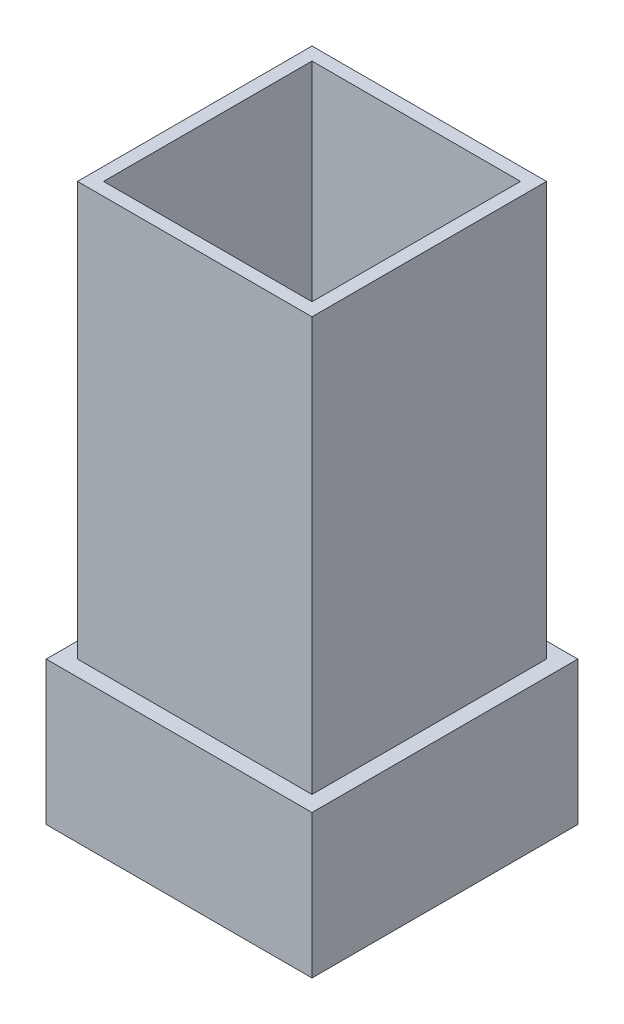
ISO-10303-21;
HEADER;
FILE_DESCRIPTION(('STEP AP214'),'2;1');
FILE_NAME('part.step','',(''),(''),'','','');
FILE_SCHEMA(('AUTOMOTIVE_DESIGN { 1 0 10303 214 1 1 1 1 }'));
ENDSEC;
DATA;
#1=APPLICATION_CONTEXT('core data for automotive mechanical design processes');
#2=APPLICATION_PROTOCOL_DEFINITION('international standard','automotive_design',2000,#1);
#3=PRODUCT_CONTEXT('',#1,'mechanical');
#4=PRODUCT('Part','Part','',(#3));
#5=PRODUCT_RELATED_PRODUCT_CATEGORY('part','',(#4));
#6=PRODUCT_DEFINITION_FORMATION('','',#4);
#7=PRODUCT_DEFINITION_CONTEXT('part definition',#1,'design');
#8=PRODUCT_DEFINITION('design','',#6,#7);
#9=PRODUCT_DEFINITION_SHAPE('','',#8);
#10=(LENGTH_UNIT() NAMED_UNIT(*) SI_UNIT(.MILLI.,.METRE.));
#11=(NAMED_UNIT(*) PLANE_ANGLE_UNIT() SI_UNIT($,.RADIAN.));
#12=(NAMED_UNIT(*) SI_UNIT($,.STERADIAN.) SOLID_ANGLE_UNIT());
#13=UNCERTAINTY_MEASURE_WITH_UNIT(LENGTH_MEASURE(1.E-05),#10,'distance_accuracy_value','');
#14=(GEOMETRIC_REPRESENTATION_CONTEXT(3) GLOBAL_UNCERTAINTY_ASSIGNED_CONTEXT((#13)) GLOBAL_UNIT_ASSIGNED_CONTEXT((#10,
#11,#12)) REPRESENTATION_CONTEXT('',''));
#15=CARTESIAN_POINT('',(0.,0.,0.));
#16=DIRECTION('',(0.,0.,1.));
#17=DIRECTION('',(1.,0.,0.));
#18=AXIS2_PLACEMENT_3D('',#15,#16,#17);
#19=CARTESIAN_POINT('',(0.,10.,0.));
#20=DIRECTION('',(0.,1.,0.));
#21=DIRECTION('',(0.,0.,1.));
#22=AXIS2_PLACEMENT_3D('',#19,#20,#21);
#23=PLANE('',#22);
#24=DIRECTION('',(0.,0.,-1.));
#25=VECTOR('',#24,1.);
#26=CARTESIAN_POINT('',(-79.0444738201403,10.,0.));
#27=LINE('',#26,#25);
#28=CARTESIAN_POINT('',(-79.0444738201403,10.,-16.4092772389049));
#29=VERTEX_POINT('',#28);
#30=CARTESIAN_POINT('',(-79.0444738201403,10.,-52.4092772389049));
#31=VERTEX_POINT('',#30);
#32=EDGE_CURVE('E260',#29,#31,#27,.T.);
#33=ORIENTED_EDGE('',*,*,#32,.T.);
#34=DIRECTION('',(-1.,0.,0.));
#35=VECTOR('',#34,1.);
#36=CARTESIAN_POINT('',(0.,10.,-52.4092772389049));
#37=LINE('',#36,#35);
#38=CARTESIAN_POINT('',(-43.0444738201403,10.,-52.4092772389049));
#39=VERTEX_POINT('',#38);
#40=EDGE_CURVE('E265',#39,#31,#37,.T.);
#41=ORIENTED_EDGE('',*,*,#40,.F.);
#42=DIRECTION('',(0.,0.,-1.));
#43=VECTOR('',#42,1.);
#44=CARTESIAN_POINT('',(-43.0444738201403,10.,0.));
#45=LINE('',#44,#43);
#46=CARTESIAN_POINT('',(-43.0444738201403,10.,-16.4092772389049));
#47=VERTEX_POINT('',#46);
#48=EDGE_CURVE('E290',#47,#39,#45,.T.);
#49=ORIENTED_EDGE('',*,*,#48,.F.);
#50=DIRECTION('',(-1.,0.,0.));
#51=VECTOR('',#50,1.);
#52=CARTESIAN_POINT('',(0.,10.,-16.4092772389049));
#53=LINE('',#52,#51);
#54=EDGE_CURVE('E287',#47,#29,#53,.T.);
#55=ORIENTED_EDGE('',*,*,#54,.T.);
#56=EDGE_LOOP('',(#33,#41,#49,#55));
#57=FACE_BOUND('',#56,.T.);
#58=DIRECTION('',(0.,0.,1.));
#59=VECTOR('',#58,1.);
#60=CARTESIAN_POINT('',(-81.4444738201403,10.,-54.8092772389049));
#61=LINE('',#60,#59);
#62=CARTESIAN_POINT('',(-81.4444738201403,10.,-54.8092772389049));
#63=VERTEX_POINT('',#62);
#64=CARTESIAN_POINT('',(-81.4444738201403,10.,-14.0092772389049));
#65=VERTEX_POINT('',#64);
#66=EDGE_CURVE('E320',#63,#65,#61,.T.);
#67=ORIENTED_EDGE('',*,*,#66,.T.);
#68=DIRECTION('',(1.,0.,0.));
#69=VECTOR('',#68,1.);
#70=CARTESIAN_POINT('',(-81.4444738201403,10.,-14.0092772389049));
#71=LINE('',#70,#69);
#72=CARTESIAN_POINT('',(-40.6444738201403,10.,-14.0092772389049));
#73=VERTEX_POINT('',#72);
#74=EDGE_CURVE('E323',#65,#73,#71,.T.);
#75=ORIENTED_EDGE('',*,*,#74,.T.);
#76=DIRECTION('',(0.,0.,-1.));
#77=VECTOR('',#76,1.);
#78=CARTESIAN_POINT('',(-40.6444738201403,10.,-54.8092772389049));
#79=LINE('',#78,#77);
#80=CARTESIAN_POINT('',(-40.6444738201403,10.,-54.8092772389049));
#81=VERTEX_POINT('',#80);
#82=EDGE_CURVE('E325',#73,#81,#79,.T.);
#83=ORIENTED_EDGE('',*,*,#82,.T.);
#84=DIRECTION('',(-1.,0.,0.));
#85=VECTOR('',#84,1.);
#86=CARTESIAN_POINT('',(-81.4444738201403,10.,-54.8092772389049));
#87=LINE('',#86,#85);
#88=EDGE_CURVE('E327',#81,#63,#87,.T.);
#89=ORIENTED_EDGE('',*,*,#88,.T.);
#90=EDGE_LOOP('',(#67,#75,#83,#89));
#91=FACE_BOUND('',#90,.T.);
#92=ADVANCED_FACE('F39',(#57,#91),#23,.T.);
#93=CARTESIAN_POINT('',(-81.4444738201403,10.,-54.8092772389049));
#94=DIRECTION('',(1.,0.,0.));
#95=DIRECTION('',(0.,0.,-1.));
#96=AXIS2_PLACEMENT_3D('',#93,#94,#95);
#97=PLANE('',#96);
#98=DIRECTION('',(0.,-1.,0.));
#99=VECTOR('',#98,1.);
#100=CARTESIAN_POINT('',(-81.4444738201403,10.,-54.8092772389049));
#101=LINE('',#100,#99);
#102=CARTESIAN_POINT('',(-81.4444738201403,-12.,-54.8092772389049));
#103=VERTEX_POINT('',#102);
#104=EDGE_CURVE('E329',#63,#103,#101,.T.);
#105=ORIENTED_EDGE('',*,*,#104,.T.);
#106=DIRECTION('',(0.,0.,-1.));
#107=VECTOR('',#106,1.);
#108=CARTESIAN_POINT('',(-81.4444738201403,-12.,-14.0092772389049));
#109=LINE('',#108,#107);
#110=CARTESIAN_POINT('',(-81.4444738201403,-12.,-14.0092772389049));
#111=VERTEX_POINT('',#110);
#112=EDGE_CURVE('E194',#111,#103,#109,.T.);
#113=ORIENTED_EDGE('',*,*,#112,.F.);
#114=DIRECTION('',(0.,-1.,0.));
#115=VECTOR('',#114,1.);
#116=CARTESIAN_POINT('',(-81.4444738201403,10.,-14.0092772389049));
#117=LINE('',#116,#115);
#118=EDGE_CURVE('E11',#65,#111,#117,.T.);
#119=ORIENTED_EDGE('',*,*,#118,.F.);
#120=ORIENTED_EDGE('',*,*,#66,.F.);
#121=EDGE_LOOP('',(#105,#113,#119,#120));
#122=FACE_BOUND('',#121,.T.);
#123=ADVANCED_FACE('F41',(#122),#97,.F.);
#124=CARTESIAN_POINT('',(-81.4444738201403,10.,-14.0092772389049));
#125=DIRECTION('',(0.,0.,-1.));
#126=DIRECTION('',(-1.,0.,0.));
#127=AXIS2_PLACEMENT_3D('',#124,#125,#126);
#128=PLANE('',#127);
#129=ORIENTED_EDGE('',*,*,#118,.T.);
#130=DIRECTION('',(-1.,0.,0.));
#131=VECTOR('',#130,1.);
#132=CARTESIAN_POINT('',(-81.4444738201403,-12.,-14.0092772389049));
#133=LINE('',#132,#131);
#134=CARTESIAN_POINT('',(-40.6444738201403,-12.,-14.0092772389049));
#135=VERTEX_POINT('',#134);
#136=EDGE_CURVE('E226',#135,#111,#133,.T.);
#137=ORIENTED_EDGE('',*,*,#136,.F.);
#138=DIRECTION('',(0.,-1.,0.));
#139=VECTOR('',#138,1.);
#140=CARTESIAN_POINT('',(-40.6444738201403,10.,-14.0092772389049));
#141=LINE('',#140,#139);
#142=EDGE_CURVE('E47',#73,#135,#141,.T.);
#143=ORIENTED_EDGE('',*,*,#142,.F.);
#144=ORIENTED_EDGE('',*,*,#74,.F.);
#145=EDGE_LOOP('',(#129,#137,#143,#144));
#146=FACE_BOUND('',#145,.T.);
#147=ADVANCED_FACE('F343',(#146),#128,.F.);
#148=CARTESIAN_POINT('',(-40.6444738201403,10.,-54.8092772389049));
#149=DIRECTION('',(-1.,0.,0.));
#150=DIRECTION('',(0.,0.,1.));
#151=AXIS2_PLACEMENT_3D('',#148,#149,#150);
#152=PLANE('',#151);
#153=ORIENTED_EDGE('',*,*,#142,.T.);
#154=DIRECTION('',(0.,0.,1.));
#155=VECTOR('',#154,1.);
#156=CARTESIAN_POINT('',(-40.6444738201403,-12.,-14.0092772389049));
#157=LINE('',#156,#155);
#158=CARTESIAN_POINT('',(-40.6444738201403,-12.,-54.8092772389049));
#159=VERTEX_POINT('',#158);
#160=EDGE_CURVE('E223',#159,#135,#157,.T.);
#161=ORIENTED_EDGE('',*,*,#160,.F.);
#162=DIRECTION('',(0.,-1.,0.));
#163=VECTOR('',#162,1.);
#164=CARTESIAN_POINT('',(-40.6444738201403,10.,-54.8092772389049));
#165=LINE('',#164,#163);
#166=EDGE_CURVE('E331',#81,#159,#165,.T.);
#167=ORIENTED_EDGE('',*,*,#166,.F.);
#168=ORIENTED_EDGE('',*,*,#82,.F.);
#169=EDGE_LOOP('',(#153,#161,#167,#168));
#170=FACE_BOUND('',#169,.T.);
#171=ADVANCED_FACE('F336',(#170),#152,.F.);
#172=CARTESIAN_POINT('',(-81.4444738201403,10.,-54.8092772389049));
#173=DIRECTION('',(0.,0.,1.));
#174=DIRECTION('',(1.,0.,0.));
#175=AXIS2_PLACEMENT_3D('',#172,#173,#174);
#176=PLANE('',#175);
#177=ORIENTED_EDGE('',*,*,#166,.T.);
#178=DIRECTION('',(1.,0.,0.));
#179=VECTOR('',#178,1.);
#180=CARTESIAN_POINT('',(-81.4444738201403,-12.,-54.8092772389049));
#181=LINE('',#180,#179);
#182=EDGE_CURVE('E220',#103,#159,#181,.T.);
#183=ORIENTED_EDGE('',*,*,#182,.F.);
#184=ORIENTED_EDGE('',*,*,#104,.F.);
#185=ORIENTED_EDGE('',*,*,#88,.F.);
#186=EDGE_LOOP('',(#177,#183,#184,#185));
#187=FACE_BOUND('',#186,.T.);
#188=ADVANCED_FACE('F350',(#187),#176,.F.);
#189=CARTESIAN_POINT('',(-77.0444738201403,10.,-50.4092772389049));
#190=DIRECTION('',(1.,0.,0.));
#191=DIRECTION('',(0.,0.,-1.));
#192=AXIS2_PLACEMENT_3D('',#189,#190,#191);
#193=PLANE('',#192);
#194=DIRECTION('',(0.,0.,1.));
#195=VECTOR('',#194,1.);
#196=CARTESIAN_POINT('',(-77.0444738201403,0.,-50.4092772389049));
#197=LINE('',#196,#195);
#198=CARTESIAN_POINT('',(-77.0444738201403,0.,-50.4092772389049));
#199=VERTEX_POINT('',#198);
#200=CARTESIAN_POINT('',(-77.0444738201403,0.,-18.4092772389049));
#201=VERTEX_POINT('',#200);
#202=EDGE_CURVE('E299',#199,#201,#197,.T.);
#203=ORIENTED_EDGE('',*,*,#202,.F.);
#204=DIRECTION('',(0.,-1.,0.));
#205=VECTOR('',#204,1.);
#206=CARTESIAN_POINT('',(-77.0444738201403,10.,-50.4092772389049));
#207=LINE('',#206,#205);
#208=CARTESIAN_POINT('',(-77.0444738201403,73.5,-50.4092772389049));
#209=VERTEX_POINT('',#208);
#210=EDGE_CURVE('E311',#209,#199,#207,.T.);
#211=ORIENTED_EDGE('',*,*,#210,.F.);
#212=DIRECTION('',(0.,0.,-1.));
#213=VECTOR('',#212,1.);
#214=CARTESIAN_POINT('',(-77.0444738201403,73.5,0.));
#215=LINE('',#214,#213);
#216=CARTESIAN_POINT('',(-77.0444738201403,73.5,-18.4092772389049));
#217=VERTEX_POINT('',#216);
#218=EDGE_CURVE('E278',#217,#209,#215,.T.);
#219=ORIENTED_EDGE('',*,*,#218,.F.);
#220=DIRECTION('',(0.,-1.,0.));
#221=VECTOR('',#220,1.);
#222=CARTESIAN_POINT('',(-77.0444738201403,10.,-18.4092772389049));
#223=LINE('',#222,#221);
#224=EDGE_CURVE('E317',#217,#201,#223,.T.);
#225=ORIENTED_EDGE('',*,*,#224,.T.);
#226=EDGE_LOOP('',(#203,#211,#219,#225));
#227=FACE_BOUND('',#226,.T.);
#228=ADVANCED_FACE('F360',(#227),#193,.T.);
#229=CARTESIAN_POINT('',(-77.0444738201403,10.,-18.4092772389049));
#230=DIRECTION('',(0.,0.,-1.));
#231=DIRECTION('',(-1.,0.,0.));
#232=AXIS2_PLACEMENT_3D('',#229,#230,#231);
#233=PLANE('',#232);
#234=DIRECTION('',(1.,0.,0.));
#235=VECTOR('',#234,1.);
#236=CARTESIAN_POINT('',(-77.0444738201403,0.,-18.4092772389049));
#237=LINE('',#236,#235);
#238=CARTESIAN_POINT('',(-45.0444738201403,0.,-18.4092772389049));
#239=VERTEX_POINT('',#238);
#240=EDGE_CURVE('E302',#201,#239,#237,.T.);
#241=ORIENTED_EDGE('',*,*,#240,.F.);
#242=ORIENTED_EDGE('',*,*,#224,.F.);
#243=DIRECTION('',(-1.,0.,0.));
#244=VECTOR('',#243,1.);
#245=CARTESIAN_POINT('',(0.,73.5,-18.4092772389049));
#246=LINE('',#245,#244);
#247=CARTESIAN_POINT('',(-45.0444738201403,73.5,-18.4092772389049));
#248=VERTEX_POINT('',#247);
#249=EDGE_CURVE('E275',#248,#217,#246,.T.);
#250=ORIENTED_EDGE('',*,*,#249,.F.);
#251=DIRECTION('',(0.,-1.,0.));
#252=VECTOR('',#251,1.);
#253=CARTESIAN_POINT('',(-45.0444738201403,10.,-18.4092772389049));
#254=LINE('',#253,#252);
#255=EDGE_CURVE('E315',#248,#239,#254,.T.);
#256=ORIENTED_EDGE('',*,*,#255,.T.);
#257=EDGE_LOOP('',(#241,#242,#250,#256));
#258=FACE_BOUND('',#257,.T.);
#259=ADVANCED_FACE('F385',(#258),#233,.T.);
#260=CARTESIAN_POINT('',(-45.0444738201403,10.,-50.4092772389049));
#261=DIRECTION('',(-1.,0.,0.));
#262=DIRECTION('',(0.,0.,1.));
#263=AXIS2_PLACEMENT_3D('',#260,#261,#262);
#264=PLANE('',#263);
#265=DIRECTION('',(0.,0.,-1.));
#266=VECTOR('',#265,1.);
#267=CARTESIAN_POINT('',(-45.0444738201403,0.,-50.4092772389049));
#268=LINE('',#267,#266);
#269=CARTESIAN_POINT('',(-45.0444738201403,0.,-50.4092772389049));
#270=VERTEX_POINT('',#269);
#271=EDGE_CURVE('E305',#239,#270,#268,.T.);
#272=ORIENTED_EDGE('',*,*,#271,.F.);
#273=ORIENTED_EDGE('',*,*,#255,.F.);
#274=DIRECTION('',(0.,0.,1.));
#275=VECTOR('',#274,1.);
#276=CARTESIAN_POINT('',(-45.0444738201403,73.5,0.));
#277=LINE('',#276,#275);
#278=CARTESIAN_POINT('',(-45.0444738201403,73.5,-50.4092772389049));
#279=VERTEX_POINT('',#278);
#280=EDGE_CURVE('E272',#279,#248,#277,.T.);
#281=ORIENTED_EDGE('',*,*,#280,.F.);
#282=DIRECTION('',(0.,-1.,0.));
#283=VECTOR('',#282,1.);
#284=CARTESIAN_POINT('',(-45.0444738201403,10.,-50.4092772389049));
#285=LINE('',#284,#283);
#286=EDGE_CURVE('E313',#279,#270,#285,.T.);
#287=ORIENTED_EDGE('',*,*,#286,.T.);
#288=EDGE_LOOP('',(#272,#273,#281,#287));
#289=FACE_BOUND('',#288,.T.);
#290=ADVANCED_FACE('F393',(#289),#264,.T.);
#291=CARTESIAN_POINT('',(-77.0444738201403,10.,-50.4092772389049));
#292=DIRECTION('',(0.,0.,1.));
#293=DIRECTION('',(1.,0.,0.));
#294=AXIS2_PLACEMENT_3D('',#291,#292,#293);
#295=PLANE('',#294);
#296=DIRECTION('',(-1.,0.,0.));
#297=VECTOR('',#296,1.);
#298=CARTESIAN_POINT('',(-77.0444738201403,0.,-50.4092772389049));
#299=LINE('',#298,#297);
#300=EDGE_CURVE('E308',#270,#199,#299,.T.);
#301=ORIENTED_EDGE('',*,*,#300,.F.);
#302=ORIENTED_EDGE('',*,*,#286,.F.);
#303=DIRECTION('',(1.,0.,0.));
#304=VECTOR('',#303,1.);
#305=CARTESIAN_POINT('',(0.,73.5,-50.4092772389049));
#306=LINE('',#305,#304);
#307=EDGE_CURVE('E281',#209,#279,#306,.T.);
#308=ORIENTED_EDGE('',*,*,#307,.F.);
#309=ORIENTED_EDGE('',*,*,#210,.T.);
#310=EDGE_LOOP('',(#301,#302,#308,#309));
#311=FACE_BOUND('',#310,.T.);
#312=ADVANCED_FACE('F400',(#311),#295,.T.);
#313=CARTESIAN_POINT('',(-79.0444738201403,73.5,0.));
#314=DIRECTION('',(-1.,0.,0.));
#315=DIRECTION('',(0.,0.,1.));
#316=AXIS2_PLACEMENT_3D('',#313,#314,#315);
#317=PLANE('',#316);
#318=ORIENTED_EDGE('',*,*,#32,.F.);
#319=DIRECTION('',(0.,-1.,0.));
#320=VECTOR('',#319,1.);
#321=CARTESIAN_POINT('',(-79.0444738201403,73.5,-16.4092772389049));
#322=LINE('',#321,#320);
#323=CARTESIAN_POINT('',(-79.0444738201403,73.5,-16.4092772389049));
#324=VERTEX_POINT('',#323);
#325=EDGE_CURVE('E297',#324,#29,#322,.T.);
#326=ORIENTED_EDGE('',*,*,#325,.F.);
#327=DIRECTION('',(0.,0.,-1.));
#328=VECTOR('',#327,1.);
#329=CARTESIAN_POINT('',(-79.0444738201403,73.5,0.));
#330=LINE('',#329,#328);
#331=CARTESIAN_POINT('',(-79.0444738201403,73.5,-52.4092772389049));
#332=VERTEX_POINT('',#331);
#333=EDGE_CURVE('E261',#324,#332,#330,.T.);
#334=ORIENTED_EDGE('',*,*,#333,.T.);
#335=DIRECTION('',(0.,-1.,0.));
#336=VECTOR('',#335,1.);
#337=CARTESIAN_POINT('',(-79.0444738201403,73.5,-52.4092772389049));
#338=LINE('',#337,#336);
#339=EDGE_CURVE('E284',#332,#31,#338,.T.);
#340=ORIENTED_EDGE('',*,*,#339,.T.);
#341=EDGE_LOOP('',(#318,#326,#334,#340));
#342=FACE_BOUND('',#341,.T.);
#343=ADVANCED_FACE('F408',(#342),#317,.T.);
#344=CARTESIAN_POINT('',(0.,73.5,-16.4092772389049));
#345=DIRECTION('',(0.,0.,1.));
#346=DIRECTION('',(1.,0.,0.));
#347=AXIS2_PLACEMENT_3D('',#344,#345,#346);
#348=PLANE('',#347);
#349=ORIENTED_EDGE('',*,*,#54,.F.);
#350=DIRECTION('',(0.,-1.,0.));
#351=VECTOR('',#350,1.);
#352=CARTESIAN_POINT('',(-43.0444738201403,73.5,-16.4092772389049));
#353=LINE('',#352,#351);
#354=CARTESIAN_POINT('',(-43.0444738201403,73.5,-16.4092772389049));
#355=VERTEX_POINT('',#354);
#356=EDGE_CURVE('E295',#355,#47,#353,.T.);
#357=ORIENTED_EDGE('',*,*,#356,.F.);
#358=DIRECTION('',(-1.,0.,0.));
#359=VECTOR('',#358,1.);
#360=CARTESIAN_POINT('',(0.,73.5,-16.4092772389049));
#361=LINE('',#360,#359);
#362=EDGE_CURVE('E264',#355,#324,#361,.T.);
#363=ORIENTED_EDGE('',*,*,#362,.T.);
#364=ORIENTED_EDGE('',*,*,#325,.T.);
#365=EDGE_LOOP('',(#349,#357,#363,#364));
#366=FACE_BOUND('',#365,.T.);
#367=ADVANCED_FACE('F417',(#366),#348,.T.);
#368=CARTESIAN_POINT('',(-43.0444738201403,73.5,0.));
#369=DIRECTION('',(-1.,0.,0.));
#370=DIRECTION('',(0.,0.,1.));
#371=AXIS2_PLACEMENT_3D('',#368,#369,#370);
#372=PLANE('',#371);
#373=ORIENTED_EDGE('',*,*,#48,.T.);
#374=DIRECTION('',(0.,-1.,0.));
#375=VECTOR('',#374,1.);
#376=CARTESIAN_POINT('',(-43.0444738201403,73.5,-52.4092772389049));
#377=LINE('',#376,#375);
#378=CARTESIAN_POINT('',(-43.0444738201403,73.5,-52.4092772389049));
#379=VERTEX_POINT('',#378);
#380=EDGE_CURVE('E62',#379,#39,#377,.T.);
#381=ORIENTED_EDGE('',*,*,#380,.F.);
#382=DIRECTION('',(0.,0.,-1.));
#383=VECTOR('',#382,1.);
#384=CARTESIAN_POINT('',(-43.0444738201403,73.5,0.));
#385=LINE('',#384,#383);
#386=EDGE_CURVE('E268',#355,#379,#385,.T.);
#387=ORIENTED_EDGE('',*,*,#386,.F.);
#388=ORIENTED_EDGE('',*,*,#356,.T.);
#389=EDGE_LOOP('',(#373,#381,#387,#388));
#390=FACE_BOUND('',#389,.T.);
#391=ADVANCED_FACE('F425',(#390),#372,.F.);
#392=CARTESIAN_POINT('',(0.,73.5,-52.4092772389049));
#393=DIRECTION('',(0.,0.,1.));
#394=DIRECTION('',(1.,0.,0.));
#395=AXIS2_PLACEMENT_3D('',#392,#393,#394);
#396=PLANE('',#395);
#397=ORIENTED_EDGE('',*,*,#40,.T.);
#398=ORIENTED_EDGE('',*,*,#339,.F.);
#399=DIRECTION('',(-1.,0.,0.));
#400=VECTOR('',#399,1.);
#401=CARTESIAN_POINT('',(0.,73.5,-52.4092772389049));
#402=LINE('',#401,#400);
#403=EDGE_CURVE('E270',#379,#332,#402,.T.);
#404=ORIENTED_EDGE('',*,*,#403,.F.);
#405=ORIENTED_EDGE('',*,*,#380,.T.);
#406=EDGE_LOOP('',(#397,#398,#404,#405));
#407=FACE_BOUND('',#406,.T.);
#408=ADVANCED_FACE('F433',(#407),#396,.F.);
#409=CARTESIAN_POINT('',(0.,73.5,0.));
#410=DIRECTION('',(0.,1.,0.));
#411=DIRECTION('',(0.,0.,1.));
#412=AXIS2_PLACEMENT_3D('',#409,#410,#411);
#413=PLANE('',#412);
#414=ORIENTED_EDGE('',*,*,#333,.F.);
#415=ORIENTED_EDGE('',*,*,#362,.F.);
#416=ORIENTED_EDGE('',*,*,#386,.T.);
#417=ORIENTED_EDGE('',*,*,#403,.T.);
#418=EDGE_LOOP('',(#414,#415,#416,#417));
#419=FACE_BOUND('',#418,.T.);
#420=ORIENTED_EDGE('',*,*,#280,.T.);
#421=ORIENTED_EDGE('',*,*,#249,.T.);
#422=ORIENTED_EDGE('',*,*,#218,.T.);
#423=ORIENTED_EDGE('',*,*,#307,.T.);
#424=EDGE_LOOP('',(#420,#421,#422,#423));
#425=FACE_BOUND('',#424,.T.);
#426=ADVANCED_FACE('F441',(#419,#425),#413,.T.);
#427=CARTESIAN_POINT('',(0.,-2.,0.));
#428=DIRECTION('',(0.,1.,0.));
#429=DIRECTION('',(0.,0.,1.));
#430=AXIS2_PLACEMENT_3D('',#427,#428,#429);
#431=PLANE('',#430);
#432=DIRECTION('',(-1.,0.,0.));
#433=VECTOR('',#432,1.);
#434=CARTESIAN_POINT('',(-79.4444738201403,-2.,-16.0092772389049));
#435=LINE('',#434,#433);
#436=CARTESIAN_POINT('',(-42.6444738201403,-2.,-16.0092772389049));
#437=VERTEX_POINT('',#436);
#438=CARTESIAN_POINT('',(-79.4444738201403,-2.,-16.0092772389049));
#439=VERTEX_POINT('',#438);
#440=EDGE_CURVE('E187',#437,#439,#435,.T.);
#441=ORIENTED_EDGE('',*,*,#440,.T.);
#442=DIRECTION('',(0.,0.,-1.));
#443=VECTOR('',#442,1.);
#444=CARTESIAN_POINT('',(-79.4444738201403,-2.,-16.0092772389049));
#445=LINE('',#444,#443);
#446=CARTESIAN_POINT('',(-79.4444738201403,-2.,-52.8092772389049));
#447=VERTEX_POINT('',#446);
#448=EDGE_CURVE('E206',#439,#447,#445,.T.);
#449=ORIENTED_EDGE('',*,*,#448,.T.);
#450=DIRECTION('',(1.,0.,0.));
#451=VECTOR('',#450,1.);
#452=CARTESIAN_POINT('',(-79.4444738201403,-2.,-52.8092772389049));
#453=LINE('',#452,#451);
#454=CARTESIAN_POINT('',(-42.6444738201403,-2.,-52.8092772389049));
#455=VERTEX_POINT('',#454);
#456=EDGE_CURVE('E193',#447,#455,#453,.T.);
#457=ORIENTED_EDGE('',*,*,#456,.T.);
#458=DIRECTION('',(0.,0.,1.));
#459=VECTOR('',#458,1.);
#460=CARTESIAN_POINT('',(-42.6444738201403,-2.,-16.0092772389049));
#461=LINE('',#460,#459);
#462=EDGE_CURVE('E209',#455,#437,#461,.T.);
#463=ORIENTED_EDGE('',*,*,#462,.T.);
#464=EDGE_LOOP('',(#441,#449,#457,#463));
#465=FACE_BOUND('',#464,.T.);
#466=DIRECTION('',(0.,0.,-1.));
#467=VECTOR('',#466,1.);
#468=CARTESIAN_POINT('',(-75.0444738201403,-2.,-20.4092772389049));
#469=LINE('',#468,#467);
#470=CARTESIAN_POINT('',(-75.0444738201403,-2.,-20.4092772389049));
#471=VERTEX_POINT('',#470);
#472=CARTESIAN_POINT('',(-75.0444738201403,-2.,-48.4092772389049));
#473=VERTEX_POINT('',#472);
#474=EDGE_CURVE('E230',#471,#473,#469,.T.);
#475=ORIENTED_EDGE('',*,*,#474,.F.);
#476=DIRECTION('',(-1.,0.,0.));
#477=VECTOR('',#476,1.);
#478=CARTESIAN_POINT('',(-75.0444738201403,-2.,-20.4092772389049));
#479=LINE('',#478,#477);
#480=CARTESIAN_POINT('',(-47.0444738201403,-2.,-20.4092772389049));
#481=VERTEX_POINT('',#480);
#482=EDGE_CURVE('E238',#481,#471,#479,.T.);
#483=ORIENTED_EDGE('',*,*,#482,.F.);
#484=DIRECTION('',(0.,0.,1.));
#485=VECTOR('',#484,1.);
#486=CARTESIAN_POINT('',(-47.0444738201403,-2.,-20.4092772389049));
#487=LINE('',#486,#485);
#488=CARTESIAN_POINT('',(-47.0444738201402,-2.,-48.4092772389049));
#489=VERTEX_POINT('',#488);
#490=EDGE_CURVE('E235',#489,#481,#487,.T.);
#491=ORIENTED_EDGE('',*,*,#490,.F.);
#492=DIRECTION('',(1.,0.,0.));
#493=VECTOR('',#492,1.);
#494=CARTESIAN_POINT('',(-75.0444738201403,-2.,-48.4092772389049));
#495=LINE('',#494,#493);
#496=EDGE_CURVE('E232',#473,#489,#495,.T.);
#497=ORIENTED_EDGE('',*,*,#496,.F.);
#498=EDGE_LOOP('',(#475,#483,#491,#497));
#499=FACE_BOUND('',#498,.T.);
#500=ADVANCED_FACE('F447',(#465,#499),#431,.F.);
#501=CARTESIAN_POINT('',(0.,0.,0.));
#502=DIRECTION('',(0.,1.,0.));
#503=DIRECTION('',(0.,0.,1.));
#504=AXIS2_PLACEMENT_3D('',#501,#502,#503);
#505=PLANE('',#504);
#506=ORIENTED_EDGE('',*,*,#300,.T.);
#507=ORIENTED_EDGE('',*,*,#202,.T.);
#508=ORIENTED_EDGE('',*,*,#240,.T.);
#509=ORIENTED_EDGE('',*,*,#271,.T.);
#510=EDGE_LOOP('',(#506,#507,#508,#509));
#511=FACE_BOUND('',#510,.T.);
#512=DIRECTION('',(-1.,0.,0.));
#513=VECTOR('',#512,1.);
#514=CARTESIAN_POINT('',(-75.0444738201403,0.,-20.4092772389049));
#515=LINE('',#514,#513);
#516=CARTESIAN_POINT('',(-47.0444738201403,0.,-20.4092772389049));
#517=VERTEX_POINT('',#516);
#518=CARTESIAN_POINT('',(-75.0444738201403,0.,-20.4092772389049));
#519=VERTEX_POINT('',#518);
#520=EDGE_CURVE('E233',#517,#519,#515,.T.);
#521=ORIENTED_EDGE('',*,*,#520,.T.);
#522=DIRECTION('',(0.,0.,-1.));
#523=VECTOR('',#522,1.);
#524=CARTESIAN_POINT('',(-75.0444738201403,0.,-20.4092772389049));
#525=LINE('',#524,#523);
#526=CARTESIAN_POINT('',(-75.0444738201403,0.,-48.4092772389049));
#527=VERTEX_POINT('',#526);
#528=EDGE_CURVE('E229',#519,#527,#525,.T.);
#529=ORIENTED_EDGE('',*,*,#528,.T.);
#530=DIRECTION('',(1.,0.,0.));
#531=VECTOR('',#530,1.);
#532=CARTESIAN_POINT('',(-75.0444738201403,0.,-48.4092772389049));
#533=LINE('',#532,#531);
#534=CARTESIAN_POINT('',(-47.0444738201402,0.,-48.4092772389049));
#535=VERTEX_POINT('',#534);
#536=EDGE_CURVE('E243',#527,#535,#533,.T.);
#537=ORIENTED_EDGE('',*,*,#536,.T.);
#538=DIRECTION('',(0.,0.,1.));
#539=VECTOR('',#538,1.);
#540=CARTESIAN_POINT('',(-47.0444738201403,0.,-20.4092772389049));
#541=LINE('',#540,#539);
#542=EDGE_CURVE('E246',#535,#517,#541,.T.);
#543=ORIENTED_EDGE('',*,*,#542,.T.);
#544=EDGE_LOOP('',(#521,#529,#537,#543));
#545=FACE_BOUND('',#544,.T.);
#546=ADVANCED_FACE('F454',(#511,#545),#505,.T.);
#547=CARTESIAN_POINT('',(-75.0444738201403,-2.,-20.4092772389049));
#548=DIRECTION('',(1.,0.,0.));
#549=DIRECTION('',(0.,0.,-1.));
#550=AXIS2_PLACEMENT_3D('',#547,#548,#549);
#551=PLANE('',#550);
#552=ORIENTED_EDGE('',*,*,#528,.F.);
#553=DIRECTION('',(0.,1.,0.));
#554=VECTOR('',#553,1.);
#555=CARTESIAN_POINT('',(-75.0444738201403,-2.,-20.4092772389049));
#556=LINE('',#555,#554);
#557=EDGE_CURVE('E240',#471,#519,#556,.T.);
#558=ORIENTED_EDGE('',*,*,#557,.F.);
#559=ORIENTED_EDGE('',*,*,#474,.T.);
#560=DIRECTION('',(0.,1.,0.));
#561=VECTOR('',#560,1.);
#562=CARTESIAN_POINT('',(-75.0444738201403,-2.,-48.4092772389049));
#563=LINE('',#562,#561);
#564=EDGE_CURVE('E257',#473,#527,#563,.T.);
#565=ORIENTED_EDGE('',*,*,#564,.T.);
#566=EDGE_LOOP('',(#552,#558,#559,#565));
#567=FACE_BOUND('',#566,.T.);
#568=ADVANCED_FACE('F462',(#567),#551,.T.);
#569=CARTESIAN_POINT('',(-75.0444738201403,-2.,-48.4092772389049));
#570=DIRECTION('',(0.,0.,1.));
#571=DIRECTION('',(1.,0.,0.));
#572=AXIS2_PLACEMENT_3D('',#569,#570,#571);
#573=PLANE('',#572);
#574=ORIENTED_EDGE('',*,*,#536,.F.);
#575=ORIENTED_EDGE('',*,*,#564,.F.);
#576=ORIENTED_EDGE('',*,*,#496,.T.);
#577=DIRECTION('',(0.,1.,0.));
#578=VECTOR('',#577,1.);
#579=CARTESIAN_POINT('',(-47.0444738201402,-2.,-48.4092772389049));
#580=LINE('',#579,#578);
#581=EDGE_CURVE('E255',#489,#535,#580,.T.);
#582=ORIENTED_EDGE('',*,*,#581,.T.);
#583=EDGE_LOOP('',(#574,#575,#576,#582));
#584=FACE_BOUND('',#583,.T.);
#585=ADVANCED_FACE('F470',(#584),#573,.T.);
#586=CARTESIAN_POINT('',(-47.0444738201403,-2.,-20.4092772389049));
#587=DIRECTION('',(-1.,0.,0.));
#588=DIRECTION('',(0.,0.,1.));
#589=AXIS2_PLACEMENT_3D('',#586,#587,#588);
#590=PLANE('',#589);
#591=ORIENTED_EDGE('',*,*,#542,.F.);
#592=ORIENTED_EDGE('',*,*,#581,.F.);
#593=ORIENTED_EDGE('',*,*,#490,.T.);
#594=DIRECTION('',(0.,1.,0.));
#595=VECTOR('',#594,1.);
#596=CARTESIAN_POINT('',(-47.0444738201403,-2.,-20.4092772389049));
#597=LINE('',#596,#595);
#598=EDGE_CURVE('E253',#481,#517,#597,.T.);
#599=ORIENTED_EDGE('',*,*,#598,.T.);
#600=EDGE_LOOP('',(#591,#592,#593,#599));
#601=FACE_BOUND('',#600,.T.);
#602=ADVANCED_FACE('F478',(#601),#590,.T.);
#603=CARTESIAN_POINT('',(-75.0444738201403,-2.,-20.4092772389049));
#604=DIRECTION('',(0.,0.,-1.));
#605=DIRECTION('',(-1.,0.,0.));
#606=AXIS2_PLACEMENT_3D('',#603,#604,#605);
#607=PLANE('',#606);
#608=ORIENTED_EDGE('',*,*,#520,.F.);
#609=ORIENTED_EDGE('',*,*,#598,.F.);
#610=ORIENTED_EDGE('',*,*,#482,.T.);
#611=ORIENTED_EDGE('',*,*,#557,.T.);
#612=EDGE_LOOP('',(#608,#609,#610,#611));
#613=FACE_BOUND('',#612,.T.);
#614=ADVANCED_FACE('F486',(#613),#607,.T.);
#615=CARTESIAN_POINT('',(0.,-12.,0.));
#616=DIRECTION('',(0.,-1.,0.));
#617=DIRECTION('',(0.,0.,-1.));
#618=AXIS2_PLACEMENT_3D('',#615,#616,#617);
#619=PLANE('',#618);
#620=ORIENTED_EDGE('',*,*,#112,.T.);
#621=ORIENTED_EDGE('',*,*,#182,.T.);
#622=ORIENTED_EDGE('',*,*,#160,.T.);
#623=ORIENTED_EDGE('',*,*,#136,.T.);
#624=EDGE_LOOP('',(#620,#621,#622,#623));
#625=FACE_BOUND('',#624,.T.);
#626=DIRECTION('',(1.,0.,0.));
#627=VECTOR('',#626,1.);
#628=CARTESIAN_POINT('',(-79.4444738201403,-12.,-52.8092772389049));
#629=LINE('',#628,#627);
#630=CARTESIAN_POINT('',(-79.4444738201403,-12.,-52.8092772389049));
#631=VERTEX_POINT('',#630);
#632=CARTESIAN_POINT('',(-42.6444738201403,-12.,-52.8092772389049));
#633=VERTEX_POINT('',#632);
#634=EDGE_CURVE('E186',#631,#633,#629,.T.);
#635=ORIENTED_EDGE('',*,*,#634,.F.);
#636=DIRECTION('',(0.,0.,-1.));
#637=VECTOR('',#636,1.);
#638=CARTESIAN_POINT('',(-79.4444738201403,-12.,-16.0092772389049));
#639=LINE('',#638,#637);
#640=CARTESIAN_POINT('',(-79.4444738201403,-12.,-16.0092772389049));
#641=VERTEX_POINT('',#640);
#642=EDGE_CURVE('E178',#641,#631,#639,.T.);
#643=ORIENTED_EDGE('',*,*,#642,.F.);
#644=DIRECTION('',(-1.,0.,0.));
#645=VECTOR('',#644,1.);
#646=CARTESIAN_POINT('',(-79.4444738201403,-12.,-16.0092772389049));
#647=LINE('',#646,#645);
#648=CARTESIAN_POINT('',(-42.6444738201403,-12.,-16.0092772389049));
#649=VERTEX_POINT('',#648);
#650=EDGE_CURVE('E202',#649,#641,#647,.T.);
#651=ORIENTED_EDGE('',*,*,#650,.F.);
#652=DIRECTION('',(0.,0.,1.));
#653=VECTOR('',#652,1.);
#654=CARTESIAN_POINT('',(-42.6444738201403,-12.,-16.0092772389049));
#655=LINE('',#654,#653);
#656=EDGE_CURVE('E200',#633,#649,#655,.T.);
#657=ORIENTED_EDGE('',*,*,#656,.F.);
#658=EDGE_LOOP('',(#635,#643,#651,#657));
#659=FACE_BOUND('',#658,.T.);
#660=ADVANCED_FACE('F198',(#625,#659),#619,.T.);
#661=CARTESIAN_POINT('',(-79.4444738201403,-12.,-16.0092772389049));
#662=DIRECTION('',(1.,0.,0.));
#663=DIRECTION('',(0.,0.,-1.));
#664=AXIS2_PLACEMENT_3D('',#661,#662,#663);
#665=PLANE('',#664);
#666=ORIENTED_EDGE('',*,*,#448,.F.);
#667=DIRECTION('',(0.,1.,0.));
#668=VECTOR('',#667,1.);
#669=CARTESIAN_POINT('',(-79.4444738201403,-12.,-16.0092772389049));
#670=LINE('',#669,#668);
#671=EDGE_CURVE('E54',#641,#439,#670,.T.);
#672=ORIENTED_EDGE('',*,*,#671,.F.);
#673=ORIENTED_EDGE('',*,*,#642,.T.);
#674=DIRECTION('',(0.,1.,0.));
#675=VECTOR('',#674,1.);
#676=CARTESIAN_POINT('',(-79.4444738201403,-12.,-52.8092772389049));
#677=LINE('',#676,#675);
#678=EDGE_CURVE('E181',#631,#447,#677,.T.);
#679=ORIENTED_EDGE('',*,*,#678,.T.);
#680=EDGE_LOOP('',(#666,#672,#673,#679));
#681=FACE_BOUND('',#680,.T.);
#682=ADVANCED_FACE('F180',(#681),#665,.T.);
#683=CARTESIAN_POINT('',(-79.4444738201403,-12.,-52.8092772389049));
#684=DIRECTION('',(0.,0.,1.));
#685=DIRECTION('',(1.,0.,0.));
#686=AXIS2_PLACEMENT_3D('',#683,#684,#685);
#687=PLANE('',#686);
#688=ORIENTED_EDGE('',*,*,#456,.F.);
#689=ORIENTED_EDGE('',*,*,#678,.F.);
#690=ORIENTED_EDGE('',*,*,#634,.T.);
#691=DIRECTION('',(0.,1.,0.));
#692=VECTOR('',#691,1.);
#693=CARTESIAN_POINT('',(-42.6444738201403,-12.,-52.8092772389049));
#694=LINE('',#693,#692);
#695=EDGE_CURVE('E195',#633,#455,#694,.T.);
#696=ORIENTED_EDGE('',*,*,#695,.T.);
#697=EDGE_LOOP('',(#688,#689,#690,#696));
#698=FACE_BOUND('',#697,.T.);
#699=ADVANCED_FACE('F190',(#698),#687,.T.);
#700=CARTESIAN_POINT('',(-42.6444738201403,-12.,-16.0092772389049));
#701=DIRECTION('',(-1.,0.,0.));
#702=DIRECTION('',(0.,0.,1.));
#703=AXIS2_PLACEMENT_3D('',#700,#701,#702);
#704=PLANE('',#703);
#705=ORIENTED_EDGE('',*,*,#462,.F.);
#706=ORIENTED_EDGE('',*,*,#695,.F.);
#707=ORIENTED_EDGE('',*,*,#656,.T.);
#708=DIRECTION('',(0.,1.,0.));
#709=VECTOR('',#708,1.);
#710=CARTESIAN_POINT('',(-42.6444738201403,-12.,-16.0092772389049));
#711=LINE('',#710,#709);
#712=EDGE_CURVE('E215',#649,#437,#711,.T.);
#713=ORIENTED_EDGE('',*,*,#712,.T.);
#714=EDGE_LOOP('',(#705,#706,#707,#713));
#715=FACE_BOUND('',#714,.T.);
#716=ADVANCED_FACE('F512',(#715),#704,.T.);
#717=CARTESIAN_POINT('',(-79.4444738201403,-12.,-16.0092772389049));
#718=DIRECTION('',(0.,0.,-1.));
#719=DIRECTION('',(-1.,0.,0.));
#720=AXIS2_PLACEMENT_3D('',#717,#718,#719);
#721=PLANE('',#720);
#722=ORIENTED_EDGE('',*,*,#440,.F.);
#723=ORIENTED_EDGE('',*,*,#712,.F.);
#724=ORIENTED_EDGE('',*,*,#650,.T.);
#725=ORIENTED_EDGE('',*,*,#671,.T.);
#726=EDGE_LOOP('',(#722,#723,#724,#725));
#727=FACE_BOUND('',#726,.T.);
#728=ADVANCED_FACE('F519',(#727),#721,.T.);
#729=CLOSED_SHELL('',(#92,#123,#147,#171,#188,#228,#259,#290,#312,#343,#367,#391,#408,#426,#500,
#546,#568,#585,#602,#614,#660,#682,#699,#716,#728));
#730=MANIFOLD_SOLID_BREP('B2',#729);
#731=ADVANCED_BREP_SHAPE_REPRESENTATION('',(#18,#730),#14);
#732=SHAPE_DEFINITION_REPRESENTATION(#9,#731);
ENDSEC;
END-ISO-10303-21;
